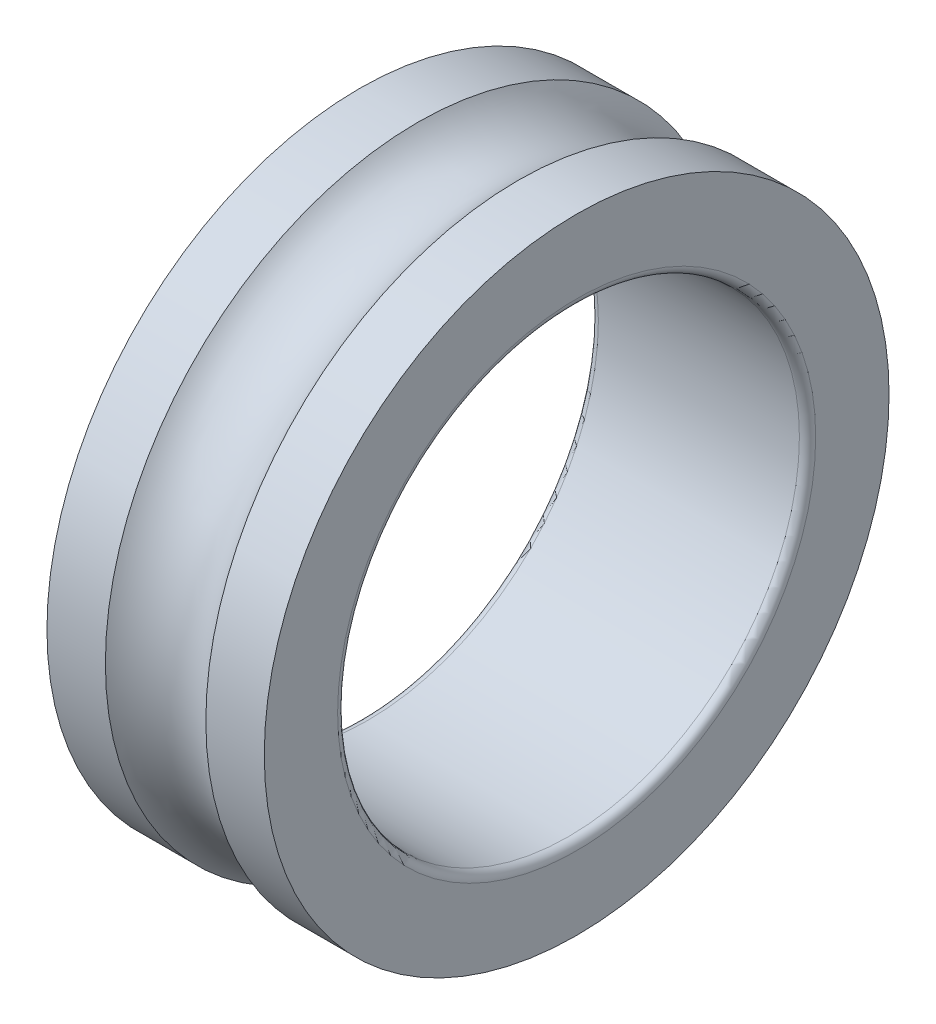
ISO-10303-21;
HEADER;
FILE_DESCRIPTION(('STEP AP214'),'2;1');
FILE_NAME('part.step','',(''),(''),'','','');
FILE_SCHEMA(('AUTOMOTIVE_DESIGN { 1 0 10303 214 1 1 1 1 }'));
ENDSEC;
DATA;
#1=APPLICATION_CONTEXT('core data for automotive mechanical design processes');
#2=APPLICATION_PROTOCOL_DEFINITION('international standard','automotive_design',2000,#1);
#3=PRODUCT_CONTEXT('',#1,'mechanical');
#4=PRODUCT('Part','Part','',(#3));
#5=PRODUCT_RELATED_PRODUCT_CATEGORY('part','',(#4));
#6=PRODUCT_DEFINITION_FORMATION('','',#4);
#7=PRODUCT_DEFINITION_CONTEXT('part definition',#1,'design');
#8=PRODUCT_DEFINITION('design','',#6,#7);
#9=PRODUCT_DEFINITION_SHAPE('','',#8);
#10=(LENGTH_UNIT() NAMED_UNIT(*) SI_UNIT(.MILLI.,.METRE.));
#11=(NAMED_UNIT(*) PLANE_ANGLE_UNIT() SI_UNIT($,.RADIAN.));
#12=(NAMED_UNIT(*) SI_UNIT($,.STERADIAN.) SOLID_ANGLE_UNIT());
#13=UNCERTAINTY_MEASURE_WITH_UNIT(LENGTH_MEASURE(1.E-05),#10,'distance_accuracy_value','');
#14=(GEOMETRIC_REPRESENTATION_CONTEXT(3) GLOBAL_UNCERTAINTY_ASSIGNED_CONTEXT((#13)) GLOBAL_UNIT_ASSIGNED_CONTEXT((#10,
#11,#12)) REPRESENTATION_CONTEXT('',''));
#15=CARTESIAN_POINT('',(0.,0.,0.));
#16=DIRECTION('',(0.,0.,1.));
#17=DIRECTION('',(1.,0.,0.));
#18=AXIS2_PLACEMENT_3D('',#15,#16,#17);
#19=CARTESIAN_POINT('',(4.,0.,0.));
#20=DIRECTION('',(-1.,0.,0.));
#21=DIRECTION('',(0.,0.,1.));
#22=AXIS2_PLACEMENT_3D('',#19,#20,#21);
#23=TOROIDAL_SURFACE('',#22,13.,2.381);
#24=CARTESIAN_POINT('',(5.84909734735627,0.,0.));
#25=DIRECTION('',(-1.,0.,0.));
#26=DIRECTION('',(0.,0.,1.));
#27=AXIS2_PLACEMENT_3D('',#24,#25,#26);
#28=CIRCLE('',#27,11.5);
#29=CARTESIAN_POINT('',(5.84909734735627,0.,11.5));
#30=VERTEX_POINT('',#29);
#31=EDGE_CURVE('E55',#30,#30,#28,.T.);
#32=ORIENTED_EDGE('',*,*,#31,.T.);
#33=EDGE_LOOP('',(#32));
#34=FACE_BOUND('',#33,.T.);
#35=CARTESIAN_POINT('',(2.15090265264373,0.,0.));
#36=DIRECTION('',(-1.,0.,0.));
#37=DIRECTION('',(0.,0.,1.));
#38=AXIS2_PLACEMENT_3D('',#35,#36,#37);
#39=CIRCLE('',#38,11.5);
#40=CARTESIAN_POINT('',(2.15090265264373,0.,11.5));
#41=VERTEX_POINT('',#40);
#42=EDGE_CURVE('E10',#41,#41,#39,.T.);
#43=ORIENTED_EDGE('',*,*,#42,.F.);
#44=EDGE_LOOP('',(#43));
#45=FACE_BOUND('',#44,.T.);
#46=ADVANCED_FACE('F14',(#34,#45),#23,.F.);
#47=CARTESIAN_POINT('',(0.,0.,0.));
#48=DIRECTION('',(-1.,0.,0.));
#49=DIRECTION('',(0.,0.,1.));
#50=AXIS2_PLACEMENT_3D('',#47,#48,#49);
#51=CYLINDRICAL_SURFACE('',#50,11.5);
#52=ORIENTED_EDGE('',*,*,#42,.T.);
#53=EDGE_LOOP('',(#52));
#54=FACE_BOUND('',#53,.T.);
#55=CARTESIAN_POINT('',(0.,0.,0.));
#56=DIRECTION('',(-1.,0.,0.));
#57=DIRECTION('',(0.,0.,1.));
#58=AXIS2_PLACEMENT_3D('',#55,#56,#57);
#59=CIRCLE('',#58,11.5);
#60=CARTESIAN_POINT('',(0.,0.,11.5));
#61=VERTEX_POINT('',#60);
#62=EDGE_CURVE('E21',#61,#61,#59,.T.);
#63=ORIENTED_EDGE('',*,*,#62,.F.);
#64=EDGE_LOOP('',(#63));
#65=FACE_BOUND('',#64,.T.);
#66=ADVANCED_FACE('F76',(#54,#65),#51,.T.);
#67=CARTESIAN_POINT('',(0.,8.8,0.));
#68=DIRECTION('',(-1.,0.,0.));
#69=DIRECTION('',(0.,0.,1.));
#70=AXIS2_PLACEMENT_3D('',#67,#68,#69);
#71=PLANE('',#70);
#72=ORIENTED_EDGE('',*,*,#62,.T.);
#73=EDGE_LOOP('',(#72));
#74=FACE_BOUND('',#73,.T.);
#75=CARTESIAN_POINT('',(0.,0.,0.));
#76=DIRECTION('',(-1.,0.,0.));
#77=DIRECTION('',(0.,0.,1.));
#78=AXIS2_PLACEMENT_3D('',#75,#76,#77);
#79=CIRCLE('',#78,8.8);
#80=CARTESIAN_POINT('',(0.,0.,8.8));
#81=VERTEX_POINT('',#80);
#82=EDGE_CURVE('E30',#81,#81,#79,.T.);
#83=ORIENTED_EDGE('',*,*,#82,.F.);
#84=EDGE_LOOP('',(#83));
#85=FACE_BOUND('',#84,.T.);
#86=ADVANCED_FACE('F80',(#74,#85),#71,.T.);
#87=CARTESIAN_POINT('',(0.3,0.,0.));
#88=DIRECTION('',(-1.,0.,0.));
#89=DIRECTION('',(0.,0.,1.));
#90=AXIS2_PLACEMENT_3D('',#87,#88,#89);
#91=TOROIDAL_SURFACE('',#90,8.8,0.3);
#92=CARTESIAN_POINT('',(0.3,0.,0.));
#93=DIRECTION('',(-1.,0.,0.));
#94=DIRECTION('',(0.,0.,1.));
#95=AXIS2_PLACEMENT_3D('',#92,#93,#94);
#96=CIRCLE('',#95,8.5);
#97=CARTESIAN_POINT('',(0.3,0.,8.5));
#98=VERTEX_POINT('',#97);
#99=EDGE_CURVE('E37',#98,#98,#96,.T.);
#100=ORIENTED_EDGE('',*,*,#99,.F.);
#101=EDGE_LOOP('',(#100));
#102=FACE_BOUND('',#101,.T.);
#103=ORIENTED_EDGE('',*,*,#82,.T.);
#104=EDGE_LOOP('',(#103));
#105=FACE_BOUND('',#104,.T.);
#106=ADVANCED_FACE('F84',(#102,#105),#91,.T.);
#107=CARTESIAN_POINT('',(0.,0.,0.));
#108=DIRECTION('',(-1.,0.,0.));
#109=DIRECTION('',(0.,0.,1.));
#110=AXIS2_PLACEMENT_3D('',#107,#108,#109);
#111=CYLINDRICAL_SURFACE('',#110,8.5);
#112=CARTESIAN_POINT('',(7.7,0.,0.));
#113=DIRECTION('',(-1.,0.,0.));
#114=DIRECTION('',(0.,0.,1.));
#115=AXIS2_PLACEMENT_3D('',#112,#113,#114);
#116=CIRCLE('',#115,8.5);
#117=CARTESIAN_POINT('',(7.7,0.,8.5));
#118=VERTEX_POINT('',#117);
#119=EDGE_CURVE('E43',#118,#118,#116,.T.);
#120=ORIENTED_EDGE('',*,*,#119,.F.);
#121=EDGE_LOOP('',(#120));
#122=FACE_BOUND('',#121,.T.);
#123=ORIENTED_EDGE('',*,*,#99,.T.);
#124=EDGE_LOOP('',(#123));
#125=FACE_BOUND('',#124,.T.);
#126=ADVANCED_FACE('F90',(#122,#125),#111,.F.);
#127=CARTESIAN_POINT('',(7.7,0.,0.));
#128=DIRECTION('',(-1.,0.,0.));
#129=DIRECTION('',(0.,0.,1.));
#130=AXIS2_PLACEMENT_3D('',#127,#128,#129);
#131=TOROIDAL_SURFACE('',#130,8.8,0.3);
#132=CARTESIAN_POINT('',(8.,0.,0.));
#133=DIRECTION('',(-1.,0.,0.));
#134=DIRECTION('',(0.,0.,1.));
#135=AXIS2_PLACEMENT_3D('',#132,#133,#134);
#136=CIRCLE('',#135,8.8);
#137=CARTESIAN_POINT('',(8.,0.,8.8));
#138=VERTEX_POINT('',#137);
#139=EDGE_CURVE('E47',#138,#138,#136,.T.);
#140=ORIENTED_EDGE('',*,*,#139,.F.);
#141=EDGE_LOOP('',(#140));
#142=FACE_BOUND('',#141,.T.);
#143=ORIENTED_EDGE('',*,*,#119,.T.);
#144=EDGE_LOOP('',(#143));
#145=FACE_BOUND('',#144,.T.);
#146=ADVANCED_FACE('F72',(#142,#145),#131,.T.);
#147=CARTESIAN_POINT('',(8.,8.8,0.));
#148=DIRECTION('',(-1.,0.,0.));
#149=DIRECTION('',(0.,0.,1.));
#150=AXIS2_PLACEMENT_3D('',#147,#148,#149);
#151=PLANE('',#150);
#152=CARTESIAN_POINT('',(8.,0.,0.));
#153=DIRECTION('',(-1.,0.,0.));
#154=DIRECTION('',(0.,0.,1.));
#155=AXIS2_PLACEMENT_3D('',#152,#153,#154);
#156=CIRCLE('',#155,11.5);
#157=CARTESIAN_POINT('',(8.,0.,11.5));
#158=VERTEX_POINT('',#157);
#159=EDGE_CURVE('E51',#158,#158,#156,.T.);
#160=ORIENTED_EDGE('',*,*,#159,.F.);
#161=EDGE_LOOP('',(#160));
#162=FACE_BOUND('',#161,.T.);
#163=ORIENTED_EDGE('',*,*,#139,.T.);
#164=EDGE_LOOP('',(#163));
#165=FACE_BOUND('',#164,.T.);
#166=ADVANCED_FACE('F65',(#162,#165),#151,.F.);
#167=CARTESIAN_POINT('',(0.,0.,0.));
#168=DIRECTION('',(-1.,0.,0.));
#169=DIRECTION('',(0.,0.,1.));
#170=AXIS2_PLACEMENT_3D('',#167,#168,#169);
#171=CYLINDRICAL_SURFACE('',#170,11.5);
#172=ORIENTED_EDGE('',*,*,#159,.T.);
#173=EDGE_LOOP('',(#172));
#174=FACE_BOUND('',#173,.T.);
#175=ORIENTED_EDGE('',*,*,#31,.F.);
#176=EDGE_LOOP('',(#175));
#177=FACE_BOUND('',#176,.T.);
#178=ADVANCED_FACE('F63',(#174,#177),#171,.T.);
#179=CLOSED_SHELL('',(#46,#66,#86,#106,#126,#146,#166,#178));
#180=MANIFOLD_SOLID_BREP('B1',#179);
#181=ADVANCED_BREP_SHAPE_REPRESENTATION('',(#18,#180),#14);
#182=SHAPE_DEFINITION_REPRESENTATION(#9,#181);
ENDSEC;
END-ISO-10303-21;
